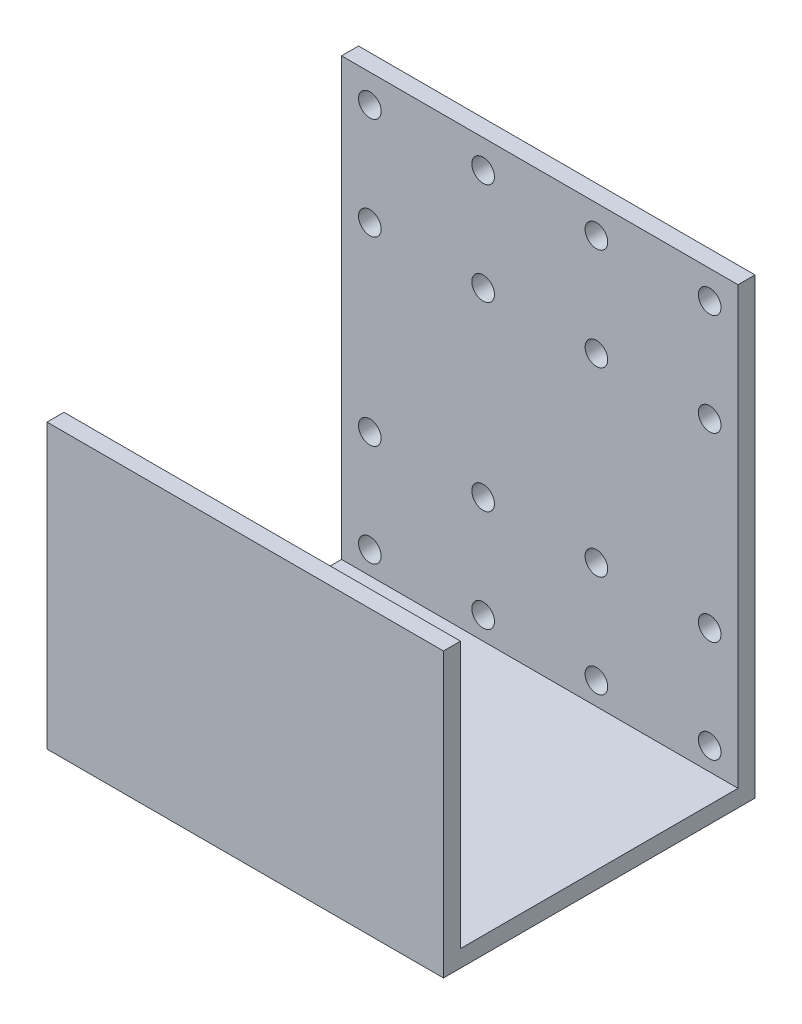
ISO-10303-21;
HEADER;
FILE_DESCRIPTION(('STEP AP214'),'2;1');
FILE_NAME('part.step','',(''),(''),'','','');
FILE_SCHEMA(('AUTOMOTIVE_DESIGN { 1 0 10303 214 1 1 1 1 }'));
ENDSEC;
DATA;
#1=APPLICATION_CONTEXT('core data for automotive mechanical design processes');
#2=APPLICATION_PROTOCOL_DEFINITION('international standard','automotive_design',2000,#1);
#3=PRODUCT_CONTEXT('',#1,'mechanical');
#4=PRODUCT('Part','Part','',(#3));
#5=PRODUCT_RELATED_PRODUCT_CATEGORY('part','',(#4));
#6=PRODUCT_DEFINITION_FORMATION('','',#4);
#7=PRODUCT_DEFINITION_CONTEXT('part definition',#1,'design');
#8=PRODUCT_DEFINITION('design','',#6,#7);
#9=PRODUCT_DEFINITION_SHAPE('','',#8);
#10=(LENGTH_UNIT() NAMED_UNIT(*) SI_UNIT(.MILLI.,.METRE.));
#11=(NAMED_UNIT(*) PLANE_ANGLE_UNIT() SI_UNIT($,.RADIAN.));
#12=(NAMED_UNIT(*) SI_UNIT($,.STERADIAN.) SOLID_ANGLE_UNIT());
#13=UNCERTAINTY_MEASURE_WITH_UNIT(LENGTH_MEASURE(1.E-05),#10,'distance_accuracy_value','');
#14=(GEOMETRIC_REPRESENTATION_CONTEXT(3) GLOBAL_UNCERTAINTY_ASSIGNED_CONTEXT((#13)) GLOBAL_UNIT_ASSIGNED_CONTEXT((#10,
#11,#12)) REPRESENTATION_CONTEXT('',''));
#15=CARTESIAN_POINT('',(0.,0.,0.));
#16=DIRECTION('',(0.,0.,1.));
#17=DIRECTION('',(1.,0.,0.));
#18=AXIS2_PLACEMENT_3D('',#15,#16,#17);
#19=CARTESIAN_POINT('',(10.,-73.,0.));
#20=DIRECTION('',(0.,0.,1.));
#21=DIRECTION('',(1.,0.,0.));
#22=AXIS2_PLACEMENT_3D('',#19,#20,#21);
#23=CYLINDRICAL_SURFACE('',#22,2.);
#24=CARTESIAN_POINT('',(10.,-73.,0.));
#25=DIRECTION('',(0.,0.,1.));
#26=DIRECTION('',(1.,0.,0.));
#27=AXIS2_PLACEMENT_3D('',#24,#25,#26);
#28=CIRCLE('',#27,2.);
#29=CARTESIAN_POINT('',(12.,-73.,0.));
#30=VERTEX_POINT('',#29);
#31=EDGE_CURVE('E53',#30,#30,#28,.T.);
#32=ORIENTED_EDGE('',*,*,#31,.F.);
#33=EDGE_LOOP('',(#32));
#34=FACE_BOUND('',#33,.T.);
#35=CARTESIAN_POINT('',(10.,-73.,3.));
#36=DIRECTION('',(0.,0.,1.));
#37=DIRECTION('',(1.,0.,0.));
#38=AXIS2_PLACEMENT_3D('',#35,#36,#37);
#39=CIRCLE('',#38,2.);
#40=CARTESIAN_POINT('',(12.,-73.,3.));
#41=VERTEX_POINT('',#40);
#42=EDGE_CURVE('E11',#41,#41,#39,.T.);
#43=ORIENTED_EDGE('',*,*,#42,.T.);
#44=EDGE_LOOP('',(#43));
#45=FACE_BOUND('',#44,.T.);
#46=ADVANCED_FACE('F45',(#34,#45),#23,.F.);
#47=CARTESIAN_POINT('',(-30.,-73.,0.));
#48=DIRECTION('',(0.,0.,1.));
#49=DIRECTION('',(1.,0.,0.));
#50=AXIS2_PLACEMENT_3D('',#47,#48,#49);
#51=CYLINDRICAL_SURFACE('',#50,2.);
#52=CARTESIAN_POINT('',(-30.,-73.,0.));
#53=DIRECTION('',(0.,0.,1.));
#54=DIRECTION('',(1.,0.,0.));
#55=AXIS2_PLACEMENT_3D('',#52,#53,#54);
#56=CIRCLE('',#55,2.);
#57=CARTESIAN_POINT('',(-28.,-73.,0.));
#58=VERTEX_POINT('',#57);
#59=EDGE_CURVE('E312',#58,#58,#56,.T.);
#60=ORIENTED_EDGE('',*,*,#59,.F.);
#61=EDGE_LOOP('',(#60));
#62=FACE_BOUND('',#61,.T.);
#63=CARTESIAN_POINT('',(-30.,-73.,3.));
#64=DIRECTION('',(0.,0.,1.));
#65=DIRECTION('',(1.,0.,0.));
#66=AXIS2_PLACEMENT_3D('',#63,#64,#65);
#67=CIRCLE('',#66,2.);
#68=CARTESIAN_POINT('',(-28.,-73.,3.));
#69=VERTEX_POINT('',#68);
#70=EDGE_CURVE('E316',#69,#69,#67,.T.);
#71=ORIENTED_EDGE('',*,*,#70,.T.);
#72=EDGE_LOOP('',(#71));
#73=FACE_BOUND('',#72,.T.);
#74=ADVANCED_FACE('F327',(#62,#73),#51,.F.);
#75=CARTESIAN_POINT('',(30.,-73.,0.));
#76=DIRECTION('',(0.,0.,1.));
#77=DIRECTION('',(1.,0.,0.));
#78=AXIS2_PLACEMENT_3D('',#75,#76,#77);
#79=CYLINDRICAL_SURFACE('',#78,2.);
#80=CARTESIAN_POINT('',(30.,-73.,0.));
#81=DIRECTION('',(0.,0.,1.));
#82=DIRECTION('',(1.,0.,0.));
#83=AXIS2_PLACEMENT_3D('',#80,#81,#82);
#84=CIRCLE('',#83,2.);
#85=CARTESIAN_POINT('',(32.,-73.,0.));
#86=VERTEX_POINT('',#85);
#87=EDGE_CURVE('E304',#86,#86,#84,.T.);
#88=ORIENTED_EDGE('',*,*,#87,.F.);
#89=EDGE_LOOP('',(#88));
#90=FACE_BOUND('',#89,.T.);
#91=CARTESIAN_POINT('',(30.,-73.,3.));
#92=DIRECTION('',(0.,0.,1.));
#93=DIRECTION('',(1.,0.,0.));
#94=AXIS2_PLACEMENT_3D('',#91,#92,#93);
#95=CIRCLE('',#94,2.);
#96=CARTESIAN_POINT('',(32.,-73.,3.));
#97=VERTEX_POINT('',#96);
#98=EDGE_CURVE('E308',#97,#97,#95,.T.);
#99=ORIENTED_EDGE('',*,*,#98,.T.);
#100=EDGE_LOOP('',(#99));
#101=FACE_BOUND('',#100,.T.);
#102=ADVANCED_FACE('F392',(#90,#101),#79,.F.);
#103=CARTESIAN_POINT('',(-9.99999999999999,-73.,0.));
#104=DIRECTION('',(0.,0.,1.));
#105=DIRECTION('',(1.,0.,0.));
#106=AXIS2_PLACEMENT_3D('',#103,#104,#105);
#107=CYLINDRICAL_SURFACE('',#106,2.);
#108=CARTESIAN_POINT('',(-9.99999999999999,-73.,0.));
#109=DIRECTION('',(0.,0.,1.));
#110=DIRECTION('',(1.,0.,0.));
#111=AXIS2_PLACEMENT_3D('',#108,#109,#110);
#112=CIRCLE('',#111,2.);
#113=CARTESIAN_POINT('',(-7.99999999999999,-73.,0.));
#114=VERTEX_POINT('',#113);
#115=EDGE_CURVE('E296',#114,#114,#112,.T.);
#116=ORIENTED_EDGE('',*,*,#115,.F.);
#117=EDGE_LOOP('',(#116));
#118=FACE_BOUND('',#117,.T.);
#119=CARTESIAN_POINT('',(-9.99999999999999,-73.,3.));
#120=DIRECTION('',(0.,0.,1.));
#121=DIRECTION('',(1.,0.,0.));
#122=AXIS2_PLACEMENT_3D('',#119,#120,#121);
#123=CIRCLE('',#122,2.);
#124=CARTESIAN_POINT('',(-7.99999999999999,-73.,3.));
#125=VERTEX_POINT('',#124);
#126=EDGE_CURVE('E300',#125,#125,#123,.T.);
#127=ORIENTED_EDGE('',*,*,#126,.T.);
#128=EDGE_LOOP('',(#127));
#129=FACE_BOUND('',#128,.T.);
#130=ADVANCED_FACE('F388',(#118,#129),#107,.F.);
#131=CARTESIAN_POINT('',(10.,-55.,0.));
#132=DIRECTION('',(0.,0.,1.));
#133=DIRECTION('',(1.,0.,0.));
#134=AXIS2_PLACEMENT_3D('',#131,#132,#133);
#135=CYLINDRICAL_SURFACE('',#134,2.);
#136=CARTESIAN_POINT('',(10.,-55.,0.));
#137=DIRECTION('',(0.,0.,1.));
#138=DIRECTION('',(1.,0.,0.));
#139=AXIS2_PLACEMENT_3D('',#136,#137,#138);
#140=CIRCLE('',#139,2.);
#141=CARTESIAN_POINT('',(12.,-55.,0.));
#142=VERTEX_POINT('',#141);
#143=EDGE_CURVE('E288',#142,#142,#140,.T.);
#144=ORIENTED_EDGE('',*,*,#143,.F.);
#145=EDGE_LOOP('',(#144));
#146=FACE_BOUND('',#145,.T.);
#147=CARTESIAN_POINT('',(10.,-55.,3.));
#148=DIRECTION('',(0.,0.,1.));
#149=DIRECTION('',(1.,0.,0.));
#150=AXIS2_PLACEMENT_3D('',#147,#148,#149);
#151=CIRCLE('',#150,2.);
#152=CARTESIAN_POINT('',(12.,-55.,3.));
#153=VERTEX_POINT('',#152);
#154=EDGE_CURVE('E292',#153,#153,#151,.T.);
#155=ORIENTED_EDGE('',*,*,#154,.T.);
#156=EDGE_LOOP('',(#155));
#157=FACE_BOUND('',#156,.T.);
#158=ADVANCED_FACE('F384',(#146,#157),#135,.F.);
#159=CARTESIAN_POINT('',(-30.,-55.,0.));
#160=DIRECTION('',(0.,0.,1.));
#161=DIRECTION('',(1.,0.,0.));
#162=AXIS2_PLACEMENT_3D('',#159,#160,#161);
#163=CYLINDRICAL_SURFACE('',#162,2.);
#164=CARTESIAN_POINT('',(-30.,-55.,0.));
#165=DIRECTION('',(0.,0.,1.));
#166=DIRECTION('',(1.,0.,0.));
#167=AXIS2_PLACEMENT_3D('',#164,#165,#166);
#168=CIRCLE('',#167,2.);
#169=CARTESIAN_POINT('',(-28.,-55.,0.));
#170=VERTEX_POINT('',#169);
#171=EDGE_CURVE('E280',#170,#170,#168,.T.);
#172=ORIENTED_EDGE('',*,*,#171,.F.);
#173=EDGE_LOOP('',(#172));
#174=FACE_BOUND('',#173,.T.);
#175=CARTESIAN_POINT('',(-30.,-55.,3.));
#176=DIRECTION('',(0.,0.,1.));
#177=DIRECTION('',(1.,0.,0.));
#178=AXIS2_PLACEMENT_3D('',#175,#176,#177);
#179=CIRCLE('',#178,2.);
#180=CARTESIAN_POINT('',(-28.,-55.,3.));
#181=VERTEX_POINT('',#180);
#182=EDGE_CURVE('E284',#181,#181,#179,.T.);
#183=ORIENTED_EDGE('',*,*,#182,.T.);
#184=EDGE_LOOP('',(#183));
#185=FACE_BOUND('',#184,.T.);
#186=ADVANCED_FACE('F380',(#174,#185),#163,.F.);
#187=CARTESIAN_POINT('',(30.,-55.,0.));
#188=DIRECTION('',(0.,0.,1.));
#189=DIRECTION('',(1.,0.,0.));
#190=AXIS2_PLACEMENT_3D('',#187,#188,#189);
#191=CYLINDRICAL_SURFACE('',#190,2.);
#192=CARTESIAN_POINT('',(30.,-55.,0.));
#193=DIRECTION('',(0.,0.,1.));
#194=DIRECTION('',(1.,0.,0.));
#195=AXIS2_PLACEMENT_3D('',#192,#193,#194);
#196=CIRCLE('',#195,2.);
#197=CARTESIAN_POINT('',(32.,-55.,0.));
#198=VERTEX_POINT('',#197);
#199=EDGE_CURVE('E272',#198,#198,#196,.T.);
#200=ORIENTED_EDGE('',*,*,#199,.F.);
#201=EDGE_LOOP('',(#200));
#202=FACE_BOUND('',#201,.T.);
#203=CARTESIAN_POINT('',(30.,-55.,3.));
#204=DIRECTION('',(0.,0.,1.));
#205=DIRECTION('',(1.,0.,0.));
#206=AXIS2_PLACEMENT_3D('',#203,#204,#205);
#207=CIRCLE('',#206,2.);
#208=CARTESIAN_POINT('',(32.,-55.,3.));
#209=VERTEX_POINT('',#208);
#210=EDGE_CURVE('E276',#209,#209,#207,.T.);
#211=ORIENTED_EDGE('',*,*,#210,.T.);
#212=EDGE_LOOP('',(#211));
#213=FACE_BOUND('',#212,.T.);
#214=ADVANCED_FACE('F376',(#202,#213),#191,.F.);
#215=CARTESIAN_POINT('',(-9.99999999999999,-55.,0.));
#216=DIRECTION('',(0.,0.,1.));
#217=DIRECTION('',(1.,0.,0.));
#218=AXIS2_PLACEMENT_3D('',#215,#216,#217);
#219=CYLINDRICAL_SURFACE('',#218,2.);
#220=CARTESIAN_POINT('',(-9.99999999999999,-55.,0.));
#221=DIRECTION('',(0.,0.,1.));
#222=DIRECTION('',(1.,0.,0.));
#223=AXIS2_PLACEMENT_3D('',#220,#221,#222);
#224=CIRCLE('',#223,2.);
#225=CARTESIAN_POINT('',(-7.99999999999999,-55.,0.));
#226=VERTEX_POINT('',#225);
#227=EDGE_CURVE('E264',#226,#226,#224,.T.);
#228=ORIENTED_EDGE('',*,*,#227,.F.);
#229=EDGE_LOOP('',(#228));
#230=FACE_BOUND('',#229,.T.);
#231=CARTESIAN_POINT('',(-9.99999999999999,-55.,3.));
#232=DIRECTION('',(0.,0.,1.));
#233=DIRECTION('',(1.,0.,0.));
#234=AXIS2_PLACEMENT_3D('',#231,#232,#233);
#235=CIRCLE('',#234,2.);
#236=CARTESIAN_POINT('',(-7.99999999999999,-55.,3.));
#237=VERTEX_POINT('',#236);
#238=EDGE_CURVE('E268',#237,#237,#235,.T.);
#239=ORIENTED_EDGE('',*,*,#238,.T.);
#240=EDGE_LOOP('',(#239));
#241=FACE_BOUND('',#240,.T.);
#242=ADVANCED_FACE('F373',(#230,#241),#219,.F.);
#243=CARTESIAN_POINT('',(-35.,-80.,55.));
#244=DIRECTION('',(1.,0.,0.));
#245=DIRECTION('',(0.,0.,-1.));
#246=AXIS2_PLACEMENT_3D('',#243,#244,#245);
#247=PLANE('',#246);
#248=DIRECTION('',(0.,0.,-1.));
#249=VECTOR('',#248,1.);
#250=CARTESIAN_POINT('',(-35.,-77.,55.));
#251=LINE('',#250,#249);
#252=CARTESIAN_POINT('',(-35.,-77.,52.));
#253=VERTEX_POINT('',#252);
#254=CARTESIAN_POINT('',(-35.,-77.,31.55));
#255=VERTEX_POINT('',#254);
#256=EDGE_CURVE('E203',#253,#255,#251,.T.);
#257=ORIENTED_EDGE('',*,*,#256,.T.);
#258=DIRECTION('',(0.,1.,0.));
#259=VECTOR('',#258,1.);
#260=CARTESIAN_POINT('',(-35.,-80.,31.55));
#261=LINE('',#260,#259);
#262=CARTESIAN_POINT('',(-35.,-80.,31.55));
#263=VERTEX_POINT('',#262);
#264=EDGE_CURVE('E176',#263,#255,#261,.T.);
#265=ORIENTED_EDGE('',*,*,#264,.F.);
#266=DIRECTION('',(0.,0.,-1.));
#267=VECTOR('',#266,1.);
#268=CARTESIAN_POINT('',(-35.,-80.,55.));
#269=LINE('',#268,#267);
#270=CARTESIAN_POINT('',(-35.,-80.,55.));
#271=VERTEX_POINT('',#270);
#272=EDGE_CURVE('E261',#271,#263,#269,.T.);
#273=ORIENTED_EDGE('',*,*,#272,.F.);
#274=DIRECTION('',(0.,-1.,0.));
#275=VECTOR('',#274,1.);
#276=CARTESIAN_POINT('',(-35.,-80.,55.));
#277=LINE('',#276,#275);
#278=CARTESIAN_POINT('',(-35.,-30.,55.));
#279=VERTEX_POINT('',#278);
#280=EDGE_CURVE('E226',#279,#271,#277,.T.);
#281=ORIENTED_EDGE('',*,*,#280,.F.);
#282=DIRECTION('',(0.,0.,-1.));
#283=VECTOR('',#282,1.);
#284=CARTESIAN_POINT('',(-35.,-30.,27.5));
#285=LINE('',#284,#283);
#286=CARTESIAN_POINT('',(-35.,-30.,52.));
#287=VERTEX_POINT('',#286);
#288=EDGE_CURVE('E218',#279,#287,#285,.T.);
#289=ORIENTED_EDGE('',*,*,#288,.T.);
#290=DIRECTION('',(0.,-1.,0.));
#291=VECTOR('',#290,1.);
#292=CARTESIAN_POINT('',(-35.,0.,52.));
#293=LINE('',#292,#291);
#294=EDGE_CURVE('E68',#287,#253,#293,.T.);
#295=ORIENTED_EDGE('',*,*,#294,.T.);
#296=EDGE_LOOP('',(#257,#265,#273,#281,#289,#295));
#297=FACE_BOUND('',#296,.T.);
#298=ADVANCED_FACE('F371',(#297),#247,.F.);
#299=CARTESIAN_POINT('',(-35.,-80.,23.45));
#300=VERTEX_POINT('',#299);
#301=CARTESIAN_POINT('',(-35.,-80.,0.));
#302=VERTEX_POINT('',#301);
#303=EDGE_CURVE('E260',#300,#302,#269,.T.);
#304=ORIENTED_EDGE('',*,*,#303,.F.);
#305=DIRECTION('',(0.,1.,0.));
#306=VECTOR('',#305,1.);
#307=CARTESIAN_POINT('',(-35.,-80.,23.45));
#308=LINE('',#307,#306);
#309=CARTESIAN_POINT('',(-35.,-77.,23.45));
#310=VERTEX_POINT('',#309);
#311=EDGE_CURVE('E141',#300,#310,#308,.T.);
#312=ORIENTED_EDGE('',*,*,#311,.T.);
#313=CARTESIAN_POINT('',(-35.,-77.,3.));
#314=VERTEX_POINT('',#313);
#315=EDGE_CURVE('E194',#310,#314,#251,.T.);
#316=ORIENTED_EDGE('',*,*,#315,.T.);
#317=DIRECTION('',(0.,-1.,0.));
#318=VECTOR('',#317,1.);
#319=CARTESIAN_POINT('',(-35.,0.,3.));
#320=LINE('',#319,#318);
#321=CARTESIAN_POINT('',(-35.,0.,3.));
#322=VERTEX_POINT('',#321);
#323=EDGE_CURVE('E185',#322,#314,#320,.T.);
#324=ORIENTED_EDGE('',*,*,#323,.F.);
#325=DIRECTION('',(0.,0.,-1.));
#326=VECTOR('',#325,1.);
#327=CARTESIAN_POINT('',(-35.,0.,55.));
#328=LINE('',#327,#326);
#329=CARTESIAN_POINT('',(-35.,0.,0.));
#330=VERTEX_POINT('',#329);
#331=EDGE_CURVE('E237',#322,#330,#328,.T.);
#332=ORIENTED_EDGE('',*,*,#331,.T.);
#333=DIRECTION('',(0.,-1.,0.));
#334=VECTOR('',#333,1.);
#335=CARTESIAN_POINT('',(-35.,-80.,0.));
#336=LINE('',#335,#334);
#337=EDGE_CURVE('E225',#330,#302,#336,.T.);
#338=ORIENTED_EDGE('',*,*,#337,.T.);
#339=EDGE_LOOP('',(#304,#312,#316,#324,#332,#338));
#340=FACE_BOUND('',#339,.T.);
#341=ADVANCED_FACE('F362',(#340),#247,.F.);
#342=CARTESIAN_POINT('',(-35.,0.,55.));
#343=DIRECTION('',(0.,-1.,0.));
#344=DIRECTION('',(1.,0.,0.));
#345=AXIS2_PLACEMENT_3D('',#342,#343,#344);
#346=PLANE('',#345);
#347=DIRECTION('',(-1.,0.,0.));
#348=VECTOR('',#347,1.);
#349=CARTESIAN_POINT('',(0.,0.,3.));
#350=LINE('',#349,#348);
#351=CARTESIAN_POINT('',(35.,0.,3.));
#352=VERTEX_POINT('',#351);
#353=EDGE_CURVE('E197',#352,#322,#350,.T.);
#354=ORIENTED_EDGE('',*,*,#353,.F.);
#355=DIRECTION('',(0.,0.,-1.));
#356=VECTOR('',#355,1.);
#357=CARTESIAN_POINT('',(35.,0.,55.));
#358=LINE('',#357,#356);
#359=CARTESIAN_POINT('',(35.,0.,0.));
#360=VERTEX_POINT('',#359);
#361=EDGE_CURVE('E253',#352,#360,#358,.T.);
#362=ORIENTED_EDGE('',*,*,#361,.T.);
#363=DIRECTION('',(-1.,0.,0.));
#364=VECTOR('',#363,1.);
#365=CARTESIAN_POINT('',(-35.,0.,0.));
#366=LINE('',#365,#364);
#367=EDGE_CURVE('E230',#360,#330,#366,.T.);
#368=ORIENTED_EDGE('',*,*,#367,.T.);
#369=ORIENTED_EDGE('',*,*,#331,.F.);
#370=EDGE_LOOP('',(#354,#362,#368,#369));
#371=FACE_BOUND('',#370,.T.);
#372=ADVANCED_FACE('F350',(#371),#346,.F.);
#373=CARTESIAN_POINT('',(-35.,-30.,27.5));
#374=DIRECTION('',(0.,-1.,0.));
#375=DIRECTION('',(0.,0.,-1.));
#376=AXIS2_PLACEMENT_3D('',#373,#374,#375);
#377=PLANE('',#376);
#378=DIRECTION('',(1.,0.,0.));
#379=VECTOR('',#378,1.);
#380=CARTESIAN_POINT('',(-35.,-30.,52.));
#381=LINE('',#380,#379);
#382=CARTESIAN_POINT('',(35.,-30.,52.));
#383=VERTEX_POINT('',#382);
#384=EDGE_CURVE('E175',#287,#383,#381,.T.);
#385=ORIENTED_EDGE('',*,*,#384,.F.);
#386=ORIENTED_EDGE('',*,*,#288,.F.);
#387=DIRECTION('',(1.,0.,0.));
#388=VECTOR('',#387,1.);
#389=CARTESIAN_POINT('',(-35.,-30.,55.));
#390=LINE('',#389,#388);
#391=CARTESIAN_POINT('',(35.,-30.,55.));
#392=VERTEX_POINT('',#391);
#393=EDGE_CURVE('E222',#279,#392,#390,.T.);
#394=ORIENTED_EDGE('',*,*,#393,.T.);
#395=DIRECTION('',(0.,0.,-1.));
#396=VECTOR('',#395,1.);
#397=CARTESIAN_POINT('',(35.,-30.,27.5));
#398=LINE('',#397,#396);
#399=EDGE_CURVE('E207',#392,#383,#398,.T.);
#400=ORIENTED_EDGE('',*,*,#399,.T.);
#401=EDGE_LOOP('',(#385,#386,#394,#400));
#402=FACE_BOUND('',#401,.T.);
#403=ADVANCED_FACE('F347',(#402),#377,.F.);
#404=CARTESIAN_POINT('',(35.,-80.,55.));
#405=DIRECTION('',(0.,1.,0.));
#406=DIRECTION('',(-1.,0.,0.));
#407=AXIS2_PLACEMENT_3D('',#404,#405,#406);
#408=PLANE('',#407);
#409=ORIENTED_EDGE('',*,*,#272,.T.);
#410=DIRECTION('',(1.,0.,0.));
#411=VECTOR('',#410,1.);
#412=CARTESIAN_POINT('',(-26.5,-80.,31.55));
#413=LINE('',#412,#411);
#414=CARTESIAN_POINT('',(-26.5,-80.,31.55));
#415=VERTEX_POINT('',#414);
#416=EDGE_CURVE('E142',#263,#415,#413,.T.);
#417=ORIENTED_EDGE('',*,*,#416,.T.);
#418=CARTESIAN_POINT('',(-26.5,-80.,27.5));
#419=DIRECTION('',(0.,1.,0.));
#420=DIRECTION('',(-1.,0.,0.));
#421=AXIS2_PLACEMENT_3D('',#418,#419,#420);
#422=CIRCLE('',#421,4.05);
#423=CARTESIAN_POINT('',(-26.5,-80.,23.45));
#424=VERTEX_POINT('',#423);
#425=EDGE_CURVE('E136',#415,#424,#422,.T.);
#426=ORIENTED_EDGE('',*,*,#425,.T.);
#427=DIRECTION('',(-1.,0.,0.));
#428=VECTOR('',#427,1.);
#429=CARTESIAN_POINT('',(-26.5,-80.,23.45));
#430=LINE('',#429,#428);
#431=EDGE_CURVE('E145',#424,#300,#430,.T.);
#432=ORIENTED_EDGE('',*,*,#431,.T.);
#433=ORIENTED_EDGE('',*,*,#303,.T.);
#434=DIRECTION('',(1.,0.,0.));
#435=VECTOR('',#434,1.);
#436=CARTESIAN_POINT('',(35.,-80.,0.));
#437=LINE('',#436,#435);
#438=CARTESIAN_POINT('',(35.,-80.,0.));
#439=VERTEX_POINT('',#438);
#440=EDGE_CURVE('E241',#302,#439,#437,.T.);
#441=ORIENTED_EDGE('',*,*,#440,.T.);
#442=DIRECTION('',(0.,0.,-1.));
#443=VECTOR('',#442,1.);
#444=CARTESIAN_POINT('',(35.,-80.,55.));
#445=LINE('',#444,#443);
#446=CARTESIAN_POINT('',(35.,-80.,55.));
#447=VERTEX_POINT('',#446);
#448=EDGE_CURVE('E256',#447,#439,#445,.T.);
#449=ORIENTED_EDGE('',*,*,#448,.F.);
#450=DIRECTION('',(1.,0.,0.));
#451=VECTOR('',#450,1.);
#452=CARTESIAN_POINT('',(35.,-80.,55.));
#453=LINE('',#452,#451);
#454=EDGE_CURVE('E229',#271,#447,#453,.T.);
#455=ORIENTED_EDGE('',*,*,#454,.F.);
#456=EDGE_LOOP('',(#409,#417,#426,#432,#433,#441,#449,#455));
#457=FACE_BOUND('',#456,.T.);
#458=ADVANCED_FACE('F153',(#457),#408,.F.);
#459=CARTESIAN_POINT('',(35.,0.,55.));
#460=DIRECTION('',(-1.,0.,0.));
#461=DIRECTION('',(0.,-1.,0.));
#462=AXIS2_PLACEMENT_3D('',#459,#460,#461);
#463=PLANE('',#462);
#464=DIRECTION('',(0.,0.,-1.));
#465=VECTOR('',#464,1.);
#466=CARTESIAN_POINT('',(35.,-77.,55.));
#467=LINE('',#466,#465);
#468=CARTESIAN_POINT('',(35.,-77.,52.));
#469=VERTEX_POINT('',#468);
#470=CARTESIAN_POINT('',(35.,-77.,3.));
#471=VERTEX_POINT('',#470);
#472=EDGE_CURVE('E190',#469,#471,#467,.T.);
#473=ORIENTED_EDGE('',*,*,#472,.F.);
#474=DIRECTION('',(0.,1.,0.));
#475=VECTOR('',#474,1.);
#476=CARTESIAN_POINT('',(35.,0.,52.));
#477=LINE('',#476,#475);
#478=EDGE_CURVE('E189',#469,#383,#477,.T.);
#479=ORIENTED_EDGE('',*,*,#478,.T.);
#480=ORIENTED_EDGE('',*,*,#399,.F.);
#481=DIRECTION('',(0.,1.,0.));
#482=VECTOR('',#481,1.);
#483=CARTESIAN_POINT('',(35.,0.,55.));
#484=LINE('',#483,#482);
#485=EDGE_CURVE('E233',#447,#392,#484,.T.);
#486=ORIENTED_EDGE('',*,*,#485,.F.);
#487=ORIENTED_EDGE('',*,*,#448,.T.);
#488=DIRECTION('',(0.,1.,0.));
#489=VECTOR('',#488,1.);
#490=CARTESIAN_POINT('',(35.,0.,0.));
#491=LINE('',#490,#489);
#492=EDGE_CURVE('E244',#439,#360,#491,.T.);
#493=ORIENTED_EDGE('',*,*,#492,.T.);
#494=ORIENTED_EDGE('',*,*,#361,.F.);
#495=DIRECTION('',(0.,1.,0.));
#496=VECTOR('',#495,1.);
#497=CARTESIAN_POINT('',(35.,0.,3.));
#498=LINE('',#497,#496);
#499=EDGE_CURVE('E184',#471,#352,#498,.T.);
#500=ORIENTED_EDGE('',*,*,#499,.F.);
#501=EDGE_LOOP('',(#473,#479,#480,#486,#487,#493,#494,#500));
#502=FACE_BOUND('',#501,.T.);
#503=ADVANCED_FACE('F355',(#502),#463,.F.);
#504=CARTESIAN_POINT('',(0.,0.,55.));
#505=DIRECTION('',(0.,0.,-1.));
#506=DIRECTION('',(-1.,0.,0.));
#507=AXIS2_PLACEMENT_3D('',#504,#505,#506);
#508=PLANE('',#507);
#509=ORIENTED_EDGE('',*,*,#485,.T.);
#510=ORIENTED_EDGE('',*,*,#393,.F.);
#511=ORIENTED_EDGE('',*,*,#280,.T.);
#512=ORIENTED_EDGE('',*,*,#454,.T.);
#513=EDGE_LOOP('',(#509,#510,#511,#512));
#514=FACE_BOUND('',#513,.T.);
#515=ADVANCED_FACE('F352',(#514),#508,.F.);
#516=CARTESIAN_POINT('',(0.,0.,0.));
#517=DIRECTION('',(0.,0.,-1.));
#518=DIRECTION('',(-1.,0.,0.));
#519=AXIS2_PLACEMENT_3D('',#516,#517,#518);
#520=PLANE('',#519);
#521=CARTESIAN_POINT('',(10.,-23.,0.));
#522=DIRECTION('',(0.,0.,1.));
#523=DIRECTION('',(1.,0.,0.));
#524=AXIS2_PLACEMENT_3D('',#521,#522,#523);
#525=CIRCLE('',#524,2.);
#526=CARTESIAN_POINT('',(12.,-23.,0.));
#527=VERTEX_POINT('',#526);
#528=EDGE_CURVE('E611',#527,#527,#525,.T.);
#529=ORIENTED_EDGE('',*,*,#528,.T.);
#530=EDGE_LOOP('',(#529));
#531=FACE_BOUND('',#530,.T.);
#532=CARTESIAN_POINT('',(30.,-23.,0.));
#533=DIRECTION('',(0.,0.,1.));
#534=DIRECTION('',(1.,0.,0.));
#535=AXIS2_PLACEMENT_3D('',#532,#533,#534);
#536=CIRCLE('',#535,2.);
#537=CARTESIAN_POINT('',(32.,-23.,0.));
#538=VERTEX_POINT('',#537);
#539=EDGE_CURVE('E615',#538,#538,#536,.T.);
#540=ORIENTED_EDGE('',*,*,#539,.T.);
#541=EDGE_LOOP('',(#540));
#542=FACE_BOUND('',#541,.T.);
#543=CARTESIAN_POINT('',(10.,-4.99999999999998,0.));
#544=DIRECTION('',(0.,0.,1.));
#545=DIRECTION('',(1.,0.,0.));
#546=AXIS2_PLACEMENT_3D('',#543,#544,#545);
#547=CIRCLE('',#546,2.);
#548=CARTESIAN_POINT('',(12.,-4.99999999999998,0.));
#549=VERTEX_POINT('',#548);
#550=EDGE_CURVE('E627',#549,#549,#547,.T.);
#551=ORIENTED_EDGE('',*,*,#550,.T.);
#552=EDGE_LOOP('',(#551));
#553=FACE_BOUND('',#552,.T.);
#554=CARTESIAN_POINT('',(30.,-4.99999999999998,0.));
#555=DIRECTION('',(0.,0.,1.));
#556=DIRECTION('',(1.,0.,0.));
#557=AXIS2_PLACEMENT_3D('',#554,#555,#556);
#558=CIRCLE('',#557,2.);
#559=CARTESIAN_POINT('',(32.,-4.99999999999998,0.));
#560=VERTEX_POINT('',#559);
#561=EDGE_CURVE('E635',#560,#560,#558,.T.);
#562=ORIENTED_EDGE('',*,*,#561,.T.);
#563=EDGE_LOOP('',(#562));
#564=FACE_BOUND('',#563,.T.);
#565=CARTESIAN_POINT('',(-9.99999999999999,-4.99999999999999,0.));
#566=DIRECTION('',(0.,0.,1.));
#567=DIRECTION('',(1.,0.,0.));
#568=AXIS2_PLACEMENT_3D('',#565,#566,#567);
#569=CIRCLE('',#568,2.);
#570=CARTESIAN_POINT('',(-7.99999999999999,-4.99999999999999,0.));
#571=VERTEX_POINT('',#570);
#572=EDGE_CURVE('E652',#571,#571,#569,.T.);
#573=ORIENTED_EDGE('',*,*,#572,.T.);
#574=EDGE_LOOP('',(#573));
#575=FACE_BOUND('',#574,.T.);
#576=CARTESIAN_POINT('',(-30.,-23.,0.));
#577=DIRECTION('',(0.,0.,1.));
#578=DIRECTION('',(1.,0.,0.));
#579=AXIS2_PLACEMENT_3D('',#576,#577,#578);
#580=CIRCLE('',#579,2.);
#581=CARTESIAN_POINT('',(-28.,-23.,0.));
#582=VERTEX_POINT('',#581);
#583=EDGE_CURVE('E660',#582,#582,#580,.T.);
#584=ORIENTED_EDGE('',*,*,#583,.T.);
#585=EDGE_LOOP('',(#584));
#586=FACE_BOUND('',#585,.T.);
#587=CARTESIAN_POINT('',(-9.99999999999999,-23.,0.));
#588=DIRECTION('',(0.,0.,1.));
#589=DIRECTION('',(1.,0.,0.));
#590=AXIS2_PLACEMENT_3D('',#587,#588,#589);
#591=CIRCLE('',#590,2.);
#592=CARTESIAN_POINT('',(-7.99999999999999,-23.,0.));
#593=VERTEX_POINT('',#592);
#594=EDGE_CURVE('E644',#593,#593,#591,.T.);
#595=ORIENTED_EDGE('',*,*,#594,.T.);
#596=EDGE_LOOP('',(#595));
#597=FACE_BOUND('',#596,.T.);
#598=CARTESIAN_POINT('',(-30.,-4.99999999999999,0.));
#599=DIRECTION('',(0.,0.,1.));
#600=DIRECTION('',(1.,0.,0.));
#601=AXIS2_PLACEMENT_3D('',#598,#599,#600);
#602=CIRCLE('',#601,2.);
#603=CARTESIAN_POINT('',(-28.,-4.99999999999999,0.));
#604=VERTEX_POINT('',#603);
#605=EDGE_CURVE('E169',#604,#604,#602,.T.);
#606=ORIENTED_EDGE('',*,*,#605,.T.);
#607=EDGE_LOOP('',(#606));
#608=FACE_BOUND('',#607,.T.);
#609=ORIENTED_EDGE('',*,*,#337,.F.);
#610=ORIENTED_EDGE('',*,*,#367,.F.);
#611=ORIENTED_EDGE('',*,*,#492,.F.);
#612=ORIENTED_EDGE('',*,*,#440,.F.);
#613=EDGE_LOOP('',(#609,#610,#611,#612));
#614=FACE_BOUND('',#613,.T.);
#615=ORIENTED_EDGE('',*,*,#227,.T.);
#616=EDGE_LOOP('',(#615));
#617=FACE_BOUND('',#616,.T.);
#618=ORIENTED_EDGE('',*,*,#199,.T.);
#619=EDGE_LOOP('',(#618));
#620=FACE_BOUND('',#619,.T.);
#621=ORIENTED_EDGE('',*,*,#171,.T.);
#622=EDGE_LOOP('',(#621));
#623=FACE_BOUND('',#622,.T.);
#624=ORIENTED_EDGE('',*,*,#143,.T.);
#625=EDGE_LOOP('',(#624));
#626=FACE_BOUND('',#625,.T.);
#627=ORIENTED_EDGE('',*,*,#115,.T.);
#628=EDGE_LOOP('',(#627));
#629=FACE_BOUND('',#628,.T.);
#630=ORIENTED_EDGE('',*,*,#87,.T.);
#631=EDGE_LOOP('',(#630));
#632=FACE_BOUND('',#631,.T.);
#633=ORIENTED_EDGE('',*,*,#59,.T.);
#634=EDGE_LOOP('',(#633));
#635=FACE_BOUND('',#634,.T.);
#636=ORIENTED_EDGE('',*,*,#31,.T.);
#637=EDGE_LOOP('',(#636));
#638=FACE_BOUND('',#637,.T.);
#639=ADVANCED_FACE('F323',(#531,#542,#553,#564,#575,#586,#597,#608,#614,#617,#620,#623,#626,
#629,#632,#635,#638),#520,.T.);
#640=CARTESIAN_POINT('',(35.,-77.,55.));
#641=DIRECTION('',(0.,1.,0.));
#642=DIRECTION('',(-1.,0.,0.));
#643=AXIS2_PLACEMENT_3D('',#640,#641,#642);
#644=PLANE('',#643);
#645=DIRECTION('',(1.,0.,0.));
#646=VECTOR('',#645,1.);
#647=CARTESIAN_POINT('',(-26.5,-77.,31.55));
#648=LINE('',#647,#646);
#649=CARTESIAN_POINT('',(-26.5,-77.,31.55));
#650=VERTEX_POINT('',#649);
#651=EDGE_CURVE('E155',#255,#650,#648,.T.);
#652=ORIENTED_EDGE('',*,*,#651,.F.);
#653=ORIENTED_EDGE('',*,*,#256,.F.);
#654=DIRECTION('',(1.,0.,0.));
#655=VECTOR('',#654,1.);
#656=CARTESIAN_POINT('',(0.,-77.,52.));
#657=LINE('',#656,#655);
#658=EDGE_CURVE('E186',#253,#469,#657,.T.);
#659=ORIENTED_EDGE('',*,*,#658,.T.);
#660=ORIENTED_EDGE('',*,*,#472,.T.);
#661=DIRECTION('',(1.,0.,0.));
#662=VECTOR('',#661,1.);
#663=CARTESIAN_POINT('',(0.,-77.,3.));
#664=LINE('',#663,#662);
#665=EDGE_CURVE('E181',#314,#471,#664,.T.);
#666=ORIENTED_EDGE('',*,*,#665,.F.);
#667=ORIENTED_EDGE('',*,*,#315,.F.);
#668=DIRECTION('',(-1.,0.,0.));
#669=VECTOR('',#668,1.);
#670=CARTESIAN_POINT('',(-26.5,-77.,23.45));
#671=LINE('',#670,#669);
#672=CARTESIAN_POINT('',(-26.5,-77.,23.45));
#673=VERTEX_POINT('',#672);
#674=EDGE_CURVE('E159',#673,#310,#671,.T.);
#675=ORIENTED_EDGE('',*,*,#674,.F.);
#676=CARTESIAN_POINT('',(-26.5,-77.,27.5));
#677=DIRECTION('',(0.,1.,0.));
#678=DIRECTION('',(-1.,0.,0.));
#679=AXIS2_PLACEMENT_3D('',#676,#677,#678);
#680=CIRCLE('',#679,4.05);
#681=EDGE_CURVE('E60',#650,#673,#680,.T.);
#682=ORIENTED_EDGE('',*,*,#681,.F.);
#683=EDGE_LOOP('',(#652,#653,#659,#660,#666,#667,#675,#682));
#684=FACE_BOUND('',#683,.T.);
#685=ADVANCED_FACE('F341',(#684),#644,.T.);
#686=CARTESIAN_POINT('',(0.,0.,52.));
#687=DIRECTION('',(0.,0.,-1.));
#688=DIRECTION('',(-1.,0.,0.));
#689=AXIS2_PLACEMENT_3D('',#686,#687,#688);
#690=PLANE('',#689);
#691=ORIENTED_EDGE('',*,*,#478,.F.);
#692=ORIENTED_EDGE('',*,*,#658,.F.);
#693=ORIENTED_EDGE('',*,*,#294,.F.);
#694=ORIENTED_EDGE('',*,*,#384,.T.);
#695=EDGE_LOOP('',(#691,#692,#693,#694));
#696=FACE_BOUND('',#695,.T.);
#697=ADVANCED_FACE('F332',(#696),#690,.T.);
#698=CARTESIAN_POINT('',(0.,0.,3.));
#699=DIRECTION('',(0.,0.,-1.));
#700=DIRECTION('',(-1.,0.,0.));
#701=AXIS2_PLACEMENT_3D('',#698,#699,#700);
#702=PLANE('',#701);
#703=CARTESIAN_POINT('',(10.,-23.,3.));
#704=DIRECTION('',(0.,0.,1.));
#705=DIRECTION('',(1.,0.,0.));
#706=AXIS2_PLACEMENT_3D('',#703,#704,#705);
#707=CIRCLE('',#706,2.);
#708=CARTESIAN_POINT('',(12.,-23.,3.));
#709=VERTEX_POINT('',#708);
#710=EDGE_CURVE('E613',#709,#709,#707,.T.);
#711=ORIENTED_EDGE('',*,*,#710,.F.);
#712=EDGE_LOOP('',(#711));
#713=FACE_BOUND('',#712,.T.);
#714=CARTESIAN_POINT('',(30.,-23.,3.));
#715=DIRECTION('',(0.,0.,1.));
#716=DIRECTION('',(1.,0.,0.));
#717=AXIS2_PLACEMENT_3D('',#714,#715,#716);
#718=CIRCLE('',#717,2.);
#719=CARTESIAN_POINT('',(32.,-23.,3.));
#720=VERTEX_POINT('',#719);
#721=EDGE_CURVE('E620',#720,#720,#718,.T.);
#722=ORIENTED_EDGE('',*,*,#721,.F.);
#723=EDGE_LOOP('',(#722));
#724=FACE_BOUND('',#723,.T.);
#725=CARTESIAN_POINT('',(10.,-4.99999999999998,3.));
#726=DIRECTION('',(0.,0.,1.));
#727=DIRECTION('',(1.,0.,0.));
#728=AXIS2_PLACEMENT_3D('',#725,#726,#727);
#729=CIRCLE('',#728,2.);
#730=CARTESIAN_POINT('',(12.,-4.99999999999998,3.));
#731=VERTEX_POINT('',#730);
#732=EDGE_CURVE('E631',#731,#731,#729,.T.);
#733=ORIENTED_EDGE('',*,*,#732,.F.);
#734=EDGE_LOOP('',(#733));
#735=FACE_BOUND('',#734,.T.);
#736=CARTESIAN_POINT('',(30.,-4.99999999999998,3.));
#737=DIRECTION('',(0.,0.,1.));
#738=DIRECTION('',(1.,0.,0.));
#739=AXIS2_PLACEMENT_3D('',#736,#737,#738);
#740=CIRCLE('',#739,2.);
#741=CARTESIAN_POINT('',(32.,-4.99999999999998,3.));
#742=VERTEX_POINT('',#741);
#743=EDGE_CURVE('E639',#742,#742,#740,.T.);
#744=ORIENTED_EDGE('',*,*,#743,.F.);
#745=EDGE_LOOP('',(#744));
#746=FACE_BOUND('',#745,.T.);
#747=CARTESIAN_POINT('',(-9.99999999999999,-4.99999999999999,3.));
#748=DIRECTION('',(0.,0.,1.));
#749=DIRECTION('',(1.,0.,0.));
#750=AXIS2_PLACEMENT_3D('',#747,#748,#749);
#751=CIRCLE('',#750,2.);
#752=CARTESIAN_POINT('',(-7.99999999999999,-4.99999999999999,3.));
#753=VERTEX_POINT('',#752);
#754=EDGE_CURVE('E656',#753,#753,#751,.T.);
#755=ORIENTED_EDGE('',*,*,#754,.F.);
#756=EDGE_LOOP('',(#755));
#757=FACE_BOUND('',#756,.T.);
#758=CARTESIAN_POINT('',(-30.,-23.,3.));
#759=DIRECTION('',(0.,0.,1.));
#760=DIRECTION('',(1.,0.,0.));
#761=AXIS2_PLACEMENT_3D('',#758,#759,#760);
#762=CIRCLE('',#761,2.);
#763=CARTESIAN_POINT('',(-28.,-23.,3.));
#764=VERTEX_POINT('',#763);
#765=EDGE_CURVE('E648',#764,#764,#762,.T.);
#766=ORIENTED_EDGE('',*,*,#765,.F.);
#767=EDGE_LOOP('',(#766));
#768=FACE_BOUND('',#767,.T.);
#769=CARTESIAN_POINT('',(-9.99999999999999,-23.,3.));
#770=DIRECTION('',(0.,0.,1.));
#771=DIRECTION('',(1.,0.,0.));
#772=AXIS2_PLACEMENT_3D('',#769,#770,#771);
#773=CIRCLE('',#772,2.);
#774=CARTESIAN_POINT('',(-7.99999999999999,-23.,3.));
#775=VERTEX_POINT('',#774);
#776=EDGE_CURVE('E643',#775,#775,#773,.T.);
#777=ORIENTED_EDGE('',*,*,#776,.F.);
#778=EDGE_LOOP('',(#777));
#779=FACE_BOUND('',#778,.T.);
#780=CARTESIAN_POINT('',(-30.,-4.99999999999999,3.));
#781=DIRECTION('',(0.,0.,1.));
#782=DIRECTION('',(1.,0.,0.));
#783=AXIS2_PLACEMENT_3D('',#780,#781,#782);
#784=CIRCLE('',#783,2.);
#785=CARTESIAN_POINT('',(-28.,-4.99999999999999,3.));
#786=VERTEX_POINT('',#785);
#787=EDGE_CURVE('E162',#786,#786,#784,.T.);
#788=ORIENTED_EDGE('',*,*,#787,.F.);
#789=EDGE_LOOP('',(#788));
#790=FACE_BOUND('',#789,.T.);
#791=ORIENTED_EDGE('',*,*,#323,.T.);
#792=ORIENTED_EDGE('',*,*,#665,.T.);
#793=ORIENTED_EDGE('',*,*,#499,.T.);
#794=ORIENTED_EDGE('',*,*,#353,.T.);
#795=EDGE_LOOP('',(#791,#792,#793,#794));
#796=FACE_BOUND('',#795,.T.);
#797=ORIENTED_EDGE('',*,*,#238,.F.);
#798=EDGE_LOOP('',(#797));
#799=FACE_BOUND('',#798,.T.);
#800=ORIENTED_EDGE('',*,*,#210,.F.);
#801=EDGE_LOOP('',(#800));
#802=FACE_BOUND('',#801,.T.);
#803=ORIENTED_EDGE('',*,*,#182,.F.);
#804=EDGE_LOOP('',(#803));
#805=FACE_BOUND('',#804,.T.);
#806=ORIENTED_EDGE('',*,*,#154,.F.);
#807=EDGE_LOOP('',(#806));
#808=FACE_BOUND('',#807,.T.);
#809=ORIENTED_EDGE('',*,*,#126,.F.);
#810=EDGE_LOOP('',(#809));
#811=FACE_BOUND('',#810,.T.);
#812=ORIENTED_EDGE('',*,*,#98,.F.);
#813=EDGE_LOOP('',(#812));
#814=FACE_BOUND('',#813,.T.);
#815=ORIENTED_EDGE('',*,*,#70,.F.);
#816=EDGE_LOOP('',(#815));
#817=FACE_BOUND('',#816,.T.);
#818=ORIENTED_EDGE('',*,*,#42,.F.);
#819=EDGE_LOOP('',(#818));
#820=FACE_BOUND('',#819,.T.);
#821=ADVANCED_FACE('F330',(#713,#724,#735,#746,#757,#768,#779,#790,#796,#799,#802,#805,#808,
#811,#814,#817,#820),#702,.F.);
#822=CARTESIAN_POINT('',(-26.5,-80.,27.5));
#823=DIRECTION('',(0.,1.,0.));
#824=DIRECTION('',(-1.,0.,0.));
#825=AXIS2_PLACEMENT_3D('',#822,#823,#824);
#826=CYLINDRICAL_SURFACE('',#825,4.05);
#827=ORIENTED_EDGE('',*,*,#681,.T.);
#828=DIRECTION('',(0.,1.,0.));
#829=VECTOR('',#828,1.);
#830=CARTESIAN_POINT('',(-26.5,-80.,23.45));
#831=LINE('',#830,#829);
#832=EDGE_CURVE('E132',#424,#673,#831,.T.);
#833=ORIENTED_EDGE('',*,*,#832,.F.);
#834=ORIENTED_EDGE('',*,*,#425,.F.);
#835=DIRECTION('',(0.,1.,0.));
#836=VECTOR('',#835,1.);
#837=CARTESIAN_POINT('',(-26.5,-80.,31.55));
#838=LINE('',#837,#836);
#839=EDGE_CURVE('E172',#415,#650,#838,.T.);
#840=ORIENTED_EDGE('',*,*,#839,.T.);
#841=EDGE_LOOP('',(#827,#833,#834,#840));
#842=FACE_BOUND('',#841,.T.);
#843=ADVANCED_FACE('F134',(#842),#826,.F.);
#844=CARTESIAN_POINT('',(-26.5,-80.,31.55));
#845=DIRECTION('',(0.,0.,1.));
#846=DIRECTION('',(1.,0.,0.));
#847=AXIS2_PLACEMENT_3D('',#844,#845,#846);
#848=PLANE('',#847);
#849=ORIENTED_EDGE('',*,*,#651,.T.);
#850=ORIENTED_EDGE('',*,*,#839,.F.);
#851=ORIENTED_EDGE('',*,*,#416,.F.);
#852=ORIENTED_EDGE('',*,*,#264,.T.);
#853=EDGE_LOOP('',(#849,#850,#851,#852));
#854=FACE_BOUND('',#853,.T.);
#855=ADVANCED_FACE('F339',(#854),#848,.F.);
#856=CARTESIAN_POINT('',(-26.5,-80.,23.45));
#857=DIRECTION('',(0.,0.,-1.));
#858=DIRECTION('',(-1.,0.,0.));
#859=AXIS2_PLACEMENT_3D('',#856,#857,#858);
#860=PLANE('',#859);
#861=ORIENTED_EDGE('',*,*,#674,.T.);
#862=ORIENTED_EDGE('',*,*,#311,.F.);
#863=ORIENTED_EDGE('',*,*,#431,.F.);
#864=ORIENTED_EDGE('',*,*,#832,.T.);
#865=EDGE_LOOP('',(#861,#862,#863,#864));
#866=FACE_BOUND('',#865,.T.);
#867=ADVANCED_FACE('F146',(#866),#860,.F.);
#868=CARTESIAN_POINT('',(-30.,-4.99999999999999,0.));
#869=DIRECTION('',(0.,0.,1.));
#870=DIRECTION('',(1.,0.,0.));
#871=AXIS2_PLACEMENT_3D('',#868,#869,#870);
#872=CYLINDRICAL_SURFACE('',#871,2.);
#873=ORIENTED_EDGE('',*,*,#605,.F.);
#874=EDGE_LOOP('',(#873));
#875=FACE_BOUND('',#874,.T.);
#876=ORIENTED_EDGE('',*,*,#787,.T.);
#877=EDGE_LOOP('',(#876));
#878=FACE_BOUND('',#877,.T.);
#879=ADVANCED_FACE('F506',(#875,#878),#872,.F.);
#880=CARTESIAN_POINT('',(-9.99999999999999,-23.,0.));
#881=DIRECTION('',(0.,0.,1.));
#882=DIRECTION('',(1.,0.,0.));
#883=AXIS2_PLACEMENT_3D('',#880,#881,#882);
#884=CYLINDRICAL_SURFACE('',#883,2.);
#885=ORIENTED_EDGE('',*,*,#594,.F.);
#886=EDGE_LOOP('',(#885));
#887=FACE_BOUND('',#886,.T.);
#888=ORIENTED_EDGE('',*,*,#776,.T.);
#889=EDGE_LOOP('',(#888));
#890=FACE_BOUND('',#889,.T.);
#891=ADVANCED_FACE('F514',(#887,#890),#884,.F.);
#892=CARTESIAN_POINT('',(-30.,-23.,0.));
#893=DIRECTION('',(0.,0.,1.));
#894=DIRECTION('',(1.,0.,0.));
#895=AXIS2_PLACEMENT_3D('',#892,#893,#894);
#896=CYLINDRICAL_SURFACE('',#895,2.);
#897=ORIENTED_EDGE('',*,*,#583,.F.);
#898=EDGE_LOOP('',(#897));
#899=FACE_BOUND('',#898,.T.);
#900=ORIENTED_EDGE('',*,*,#765,.T.);
#901=EDGE_LOOP('',(#900));
#902=FACE_BOUND('',#901,.T.);
#903=ADVANCED_FACE('F523',(#899,#902),#896,.F.);
#904=CARTESIAN_POINT('',(-9.99999999999999,-4.99999999999999,0.));
#905=DIRECTION('',(0.,0.,1.));
#906=DIRECTION('',(1.,0.,0.));
#907=AXIS2_PLACEMENT_3D('',#904,#905,#906);
#908=CYLINDRICAL_SURFACE('',#907,2.);
#909=ORIENTED_EDGE('',*,*,#572,.F.);
#910=EDGE_LOOP('',(#909));
#911=FACE_BOUND('',#910,.T.);
#912=ORIENTED_EDGE('',*,*,#754,.T.);
#913=EDGE_LOOP('',(#912));
#914=FACE_BOUND('',#913,.T.);
#915=ADVANCED_FACE('F532',(#911,#914),#908,.F.);
#916=CARTESIAN_POINT('',(30.,-4.99999999999998,0.));
#917=DIRECTION('',(0.,0.,1.));
#918=DIRECTION('',(1.,0.,0.));
#919=AXIS2_PLACEMENT_3D('',#916,#917,#918);
#920=CYLINDRICAL_SURFACE('',#919,2.);
#921=ORIENTED_EDGE('',*,*,#561,.F.);
#922=EDGE_LOOP('',(#921));
#923=FACE_BOUND('',#922,.T.);
#924=ORIENTED_EDGE('',*,*,#743,.T.);
#925=EDGE_LOOP('',(#924));
#926=FACE_BOUND('',#925,.T.);
#927=ADVANCED_FACE('F541',(#923,#926),#920,.F.);
#928=CARTESIAN_POINT('',(10.,-4.99999999999998,0.));
#929=DIRECTION('',(0.,0.,1.));
#930=DIRECTION('',(1.,0.,0.));
#931=AXIS2_PLACEMENT_3D('',#928,#929,#930);
#932=CYLINDRICAL_SURFACE('',#931,2.);
#933=ORIENTED_EDGE('',*,*,#550,.F.);
#934=EDGE_LOOP('',(#933));
#935=FACE_BOUND('',#934,.T.);
#936=ORIENTED_EDGE('',*,*,#732,.T.);
#937=EDGE_LOOP('',(#936));
#938=FACE_BOUND('',#937,.T.);
#939=ADVANCED_FACE('F568',(#935,#938),#932,.F.);
#940=CARTESIAN_POINT('',(30.,-23.,0.));
#941=DIRECTION('',(0.,0.,1.));
#942=DIRECTION('',(1.,0.,0.));
#943=AXIS2_PLACEMENT_3D('',#940,#941,#942);
#944=CYLINDRICAL_SURFACE('',#943,2.);
#945=ORIENTED_EDGE('',*,*,#539,.F.);
#946=EDGE_LOOP('',(#945));
#947=FACE_BOUND('',#946,.T.);
#948=ORIENTED_EDGE('',*,*,#721,.T.);
#949=EDGE_LOOP('',(#948));
#950=FACE_BOUND('',#949,.T.);
#951=ADVANCED_FACE('F577',(#947,#950),#944,.F.);
#952=CARTESIAN_POINT('',(10.,-23.,0.));
#953=DIRECTION('',(0.,0.,1.));
#954=DIRECTION('',(1.,0.,0.));
#955=AXIS2_PLACEMENT_3D('',#952,#953,#954);
#956=CYLINDRICAL_SURFACE('',#955,2.);
#957=ORIENTED_EDGE('',*,*,#528,.F.);
#958=EDGE_LOOP('',(#957));
#959=FACE_BOUND('',#958,.T.);
#960=ORIENTED_EDGE('',*,*,#710,.T.);
#961=EDGE_LOOP('',(#960));
#962=FACE_BOUND('',#961,.T.);
#963=ADVANCED_FACE('F586',(#959,#962),#956,.F.);
#964=CLOSED_SHELL('',(#46,#74,#102,#130,#158,#186,#214,#242,#298,#341,#372,#403,#458,#503,#515,
#639,#685,#697,#821,#843,#855,#867,#879,#891,#903,#915,#927,#939,#951,#963));
#965=MANIFOLD_SOLID_BREP('B2',#964);
#966=ADVANCED_BREP_SHAPE_REPRESENTATION('',(#18,#965),#14);
#967=SHAPE_DEFINITION_REPRESENTATION(#9,#966);
ENDSEC;
END-ISO-10303-21;
